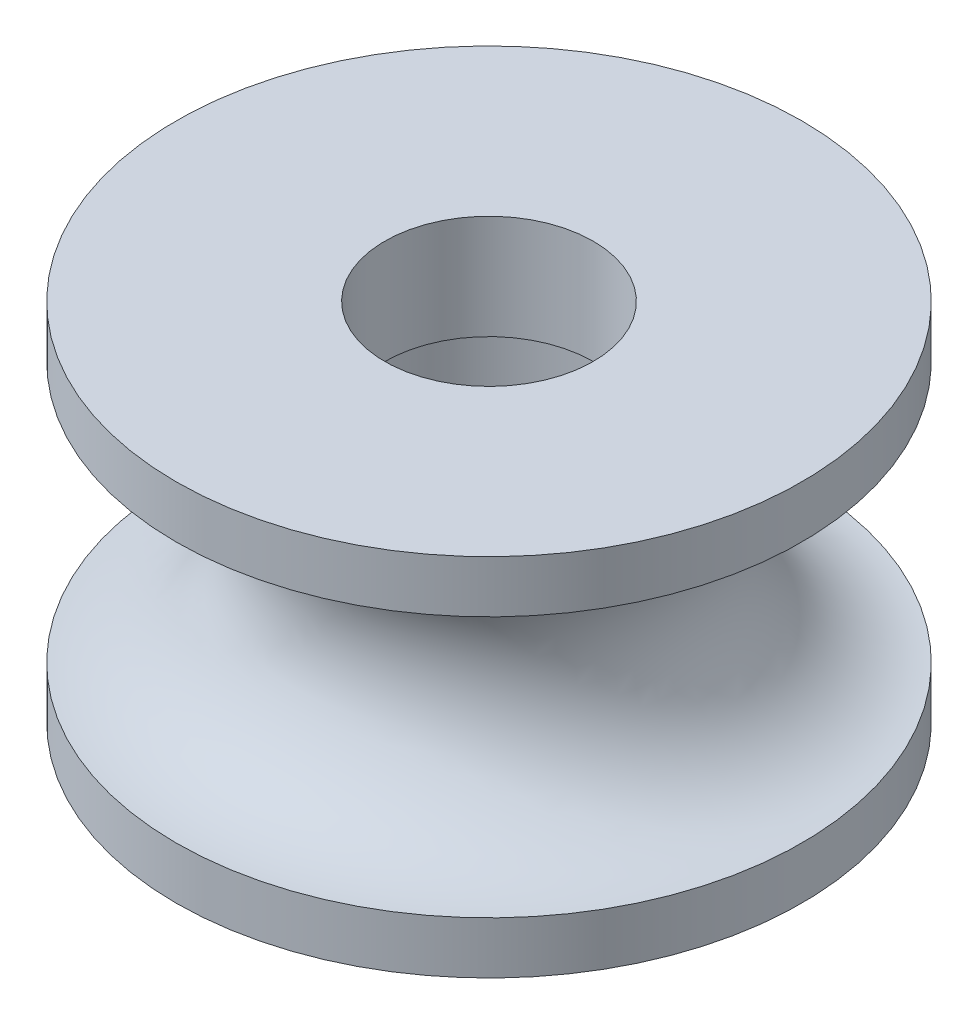
ISO-10303-21;
HEADER;
FILE_DESCRIPTION(('STEP AP214'),'2;1');
FILE_NAME('part.step','',(''),(''),'','','');
FILE_SCHEMA(('AUTOMOTIVE_DESIGN { 1 0 10303 214 1 1 1 1 }'));
ENDSEC;
DATA;
#1=APPLICATION_CONTEXT('core data for automotive mechanical design processes');
#2=APPLICATION_PROTOCOL_DEFINITION('international standard','automotive_design',2000,#1);
#3=PRODUCT_CONTEXT('',#1,'mechanical');
#4=PRODUCT('Part','Part','',(#3));
#5=PRODUCT_RELATED_PRODUCT_CATEGORY('part','',(#4));
#6=PRODUCT_DEFINITION_FORMATION('','',#4);
#7=PRODUCT_DEFINITION_CONTEXT('part definition',#1,'design');
#8=PRODUCT_DEFINITION('design','',#6,#7);
#9=PRODUCT_DEFINITION_SHAPE('','',#8);
#10=(LENGTH_UNIT() NAMED_UNIT(*) SI_UNIT(.MILLI.,.METRE.));
#11=(NAMED_UNIT(*) PLANE_ANGLE_UNIT() SI_UNIT($,.RADIAN.));
#12=(NAMED_UNIT(*) SI_UNIT($,.STERADIAN.) SOLID_ANGLE_UNIT());
#13=UNCERTAINTY_MEASURE_WITH_UNIT(LENGTH_MEASURE(1.E-05),#10,'distance_accuracy_value','');
#14=(GEOMETRIC_REPRESENTATION_CONTEXT(3) GLOBAL_UNCERTAINTY_ASSIGNED_CONTEXT((#13)) GLOBAL_UNIT_ASSIGNED_CONTEXT((#10,
#11,#12)) REPRESENTATION_CONTEXT('',''));
#15=CARTESIAN_POINT('',(0.,0.,0.));
#16=DIRECTION('',(0.,0.,1.));
#17=DIRECTION('',(1.,0.,0.));
#18=AXIS2_PLACEMENT_3D('',#15,#16,#17);
#19=CARTESIAN_POINT('',(-12.,-7.,0.));
#20=DIRECTION('',(0.,1.,0.));
#21=DIRECTION('',(0.,0.,1.));
#22=AXIS2_PLACEMENT_3D('',#19,#20,#21);
#23=PLANE('',#22);
#24=CARTESIAN_POINT('',(0.,-7.,0.));
#25=DIRECTION('',(0.,-1.,0.));
#26=DIRECTION('',(0.,0.,-1.));
#27=AXIS2_PLACEMENT_3D('',#24,#25,#26);
#28=CIRCLE('',#27,5.1);
#29=CARTESIAN_POINT('',(0.,-7.,-5.1));
#30=VERTEX_POINT('',#29);
#31=EDGE_CURVE('E75',#30,#30,#28,.T.);
#32=ORIENTED_EDGE('',*,*,#31,.F.);
#33=EDGE_LOOP('',(#32));
#34=FACE_BOUND('',#33,.T.);
#35=CARTESIAN_POINT('',(0.,-7.,0.));
#36=DIRECTION('',(0.,-1.,0.));
#37=DIRECTION('',(0.,0.,-1.));
#38=AXIS2_PLACEMENT_3D('',#35,#36,#37);
#39=CIRCLE('',#38,12.);
#40=CARTESIAN_POINT('',(0.,-7.,-12.));
#41=VERTEX_POINT('',#40);
#42=EDGE_CURVE('E10',#41,#41,#39,.T.);
#43=ORIENTED_EDGE('',*,*,#42,.T.);
#44=EDGE_LOOP('',(#43));
#45=FACE_BOUND('',#44,.T.);
#46=ADVANCED_FACE('F43',(#34,#45),#23,.F.);
#47=CARTESIAN_POINT('',(0.,0.,0.));
#48=DIRECTION('',(0.,-1.,0.));
#49=DIRECTION('',(0.,0.,-1.));
#50=AXIS2_PLACEMENT_3D('',#47,#48,#49);
#51=CYLINDRICAL_SURFACE('',#50,12.);
#52=ORIENTED_EDGE('',*,*,#42,.F.);
#53=EDGE_LOOP('',(#52));
#54=FACE_BOUND('',#53,.T.);
#55=CARTESIAN_POINT('',(0.,-5.,0.));
#56=DIRECTION('',(0.,-1.,0.));
#57=DIRECTION('',(0.,0.,-1.));
#58=AXIS2_PLACEMENT_3D('',#55,#56,#57);
#59=CIRCLE('',#58,12.);
#60=CARTESIAN_POINT('',(0.,-5.,-12.));
#61=VERTEX_POINT('',#60);
#62=EDGE_CURVE('E50',#61,#61,#59,.T.);
#63=ORIENTED_EDGE('',*,*,#62,.T.);
#64=EDGE_LOOP('',(#63));
#65=FACE_BOUND('',#64,.T.);
#66=ADVANCED_FACE('F93',(#54,#65),#51,.T.);
#67=CARTESIAN_POINT('',(0.,0.,0.));
#68=DIRECTION('',(0.,-1.,0.));
#69=DIRECTION('',(0.,0.,-1.));
#70=AXIS2_PLACEMENT_3D('',#67,#68,#69);
#71=TOROIDAL_SURFACE('',#70,12.,5.);
#72=ORIENTED_EDGE('',*,*,#62,.F.);
#73=EDGE_LOOP('',(#72));
#74=FACE_BOUND('',#73,.T.);
#75=CARTESIAN_POINT('',(0.,5.,0.));
#76=DIRECTION('',(0.,-1.,0.));
#77=DIRECTION('',(0.,0.,-1.));
#78=AXIS2_PLACEMENT_3D('',#75,#76,#77);
#79=CIRCLE('',#78,12.);
#80=CARTESIAN_POINT('',(0.,5.,-12.));
#81=VERTEX_POINT('',#80);
#82=EDGE_CURVE('E55',#81,#81,#79,.T.);
#83=ORIENTED_EDGE('',*,*,#82,.T.);
#84=EDGE_LOOP('',(#83));
#85=FACE_BOUND('',#84,.T.);
#86=ADVANCED_FACE('F99',(#74,#85),#71,.F.);
#87=CARTESIAN_POINT('',(0.,0.,0.));
#88=DIRECTION('',(0.,-1.,0.));
#89=DIRECTION('',(0.,0.,-1.));
#90=AXIS2_PLACEMENT_3D('',#87,#88,#89);
#91=CYLINDRICAL_SURFACE('',#90,12.);
#92=CARTESIAN_POINT('',(0.,7.,0.));
#93=DIRECTION('',(0.,-1.,0.));
#94=DIRECTION('',(0.,0.,-1.));
#95=AXIS2_PLACEMENT_3D('',#92,#93,#94);
#96=CIRCLE('',#95,12.);
#97=CARTESIAN_POINT('',(0.,7.,-12.));
#98=VERTEX_POINT('',#97);
#99=EDGE_CURVE('E60',#98,#98,#96,.T.);
#100=ORIENTED_EDGE('',*,*,#99,.T.);
#101=EDGE_LOOP('',(#100));
#102=FACE_BOUND('',#101,.T.);
#103=ORIENTED_EDGE('',*,*,#82,.F.);
#104=EDGE_LOOP('',(#103));
#105=FACE_BOUND('',#104,.T.);
#106=ADVANCED_FACE('F104',(#102,#105),#91,.T.);
#107=CARTESIAN_POINT('',(-12.,7.,0.));
#108=DIRECTION('',(0.,1.,0.));
#109=DIRECTION('',(0.,0.,1.));
#110=AXIS2_PLACEMENT_3D('',#107,#108,#109);
#111=PLANE('',#110);
#112=ORIENTED_EDGE('',*,*,#99,.F.);
#113=EDGE_LOOP('',(#112));
#114=FACE_BOUND('',#113,.T.);
#115=CARTESIAN_POINT('',(0.,7.,0.));
#116=DIRECTION('',(0.,-1.,0.));
#117=DIRECTION('',(0.,0.,-1.));
#118=AXIS2_PLACEMENT_3D('',#115,#116,#117);
#119=CIRCLE('',#118,4.);
#120=CARTESIAN_POINT('',(0.,7.,-4.));
#121=VERTEX_POINT('',#120);
#122=EDGE_CURVE('E70',#121,#121,#119,.T.);
#123=ORIENTED_EDGE('',*,*,#122,.T.);
#124=EDGE_LOOP('',(#123));
#125=FACE_BOUND('',#124,.T.);
#126=ADVANCED_FACE('F110',(#114,#125),#111,.T.);
#127=CARTESIAN_POINT('',(-5.,3.,0.));
#128=DIRECTION('',(0.,1.,0.));
#129=DIRECTION('',(0.,0.,1.));
#130=AXIS2_PLACEMENT_3D('',#127,#128,#129);
#131=PLANE('',#130);
#132=CARTESIAN_POINT('',(0.,3.,0.));
#133=DIRECTION('',(0.,-1.,0.));
#134=DIRECTION('',(0.,0.,-1.));
#135=AXIS2_PLACEMENT_3D('',#132,#133,#134);
#136=CIRCLE('',#135,4.);
#137=CARTESIAN_POINT('',(0.,3.,-4.));
#138=VERTEX_POINT('',#137);
#139=EDGE_CURVE('E66',#138,#138,#136,.T.);
#140=ORIENTED_EDGE('',*,*,#139,.F.);
#141=EDGE_LOOP('',(#140));
#142=FACE_BOUND('',#141,.T.);
#143=CARTESIAN_POINT('',(0.,3.,0.));
#144=DIRECTION('',(0.,-1.,0.));
#145=DIRECTION('',(0.,0.,-1.));
#146=AXIS2_PLACEMENT_3D('',#143,#144,#145);
#147=CIRCLE('',#146,5.1);
#148=CARTESIAN_POINT('',(0.,3.,-5.1));
#149=VERTEX_POINT('',#148);
#150=EDGE_CURVE('E74',#149,#149,#147,.T.);
#151=ORIENTED_EDGE('',*,*,#150,.T.);
#152=EDGE_LOOP('',(#151));
#153=FACE_BOUND('',#152,.T.);
#154=ADVANCED_FACE('F83',(#142,#153),#131,.F.);
#155=CARTESIAN_POINT('',(0.,0.,0.));
#156=DIRECTION('',(0.,-1.,0.));
#157=DIRECTION('',(0.,0.,-1.));
#158=AXIS2_PLACEMENT_3D('',#155,#156,#157);
#159=CYLINDRICAL_SURFACE('',#158,4.);
#160=ORIENTED_EDGE('',*,*,#122,.F.);
#161=EDGE_LOOP('',(#160));
#162=FACE_BOUND('',#161,.T.);
#163=ORIENTED_EDGE('',*,*,#139,.T.);
#164=EDGE_LOOP('',(#163));
#165=FACE_BOUND('',#164,.T.);
#166=ADVANCED_FACE('F88',(#162,#165),#159,.F.);
#167=CARTESIAN_POINT('',(0.,3.,0.));
#168=DIRECTION('',(0.,-1.,0.));
#169=DIRECTION('',(0.,0.,-1.));
#170=AXIS2_PLACEMENT_3D('',#167,#168,#169);
#171=CYLINDRICAL_SURFACE('',#170,5.1);
#172=ORIENTED_EDGE('',*,*,#150,.F.);
#173=EDGE_LOOP('',(#172));
#174=FACE_BOUND('',#173,.T.);
#175=ORIENTED_EDGE('',*,*,#31,.T.);
#176=EDGE_LOOP('',(#175));
#177=FACE_BOUND('',#176,.T.);
#178=ADVANCED_FACE('F85',(#174,#177),#171,.F.);
#179=CLOSED_SHELL('',(#46,#66,#86,#106,#126,#154,#166,#178));
#180=MANIFOLD_SOLID_BREP('B2',#179);
#181=ADVANCED_BREP_SHAPE_REPRESENTATION('',(#18,#180),#14);
#182=SHAPE_DEFINITION_REPRESENTATION(#9,#181);
ENDSEC;
END-ISO-10303-21;
